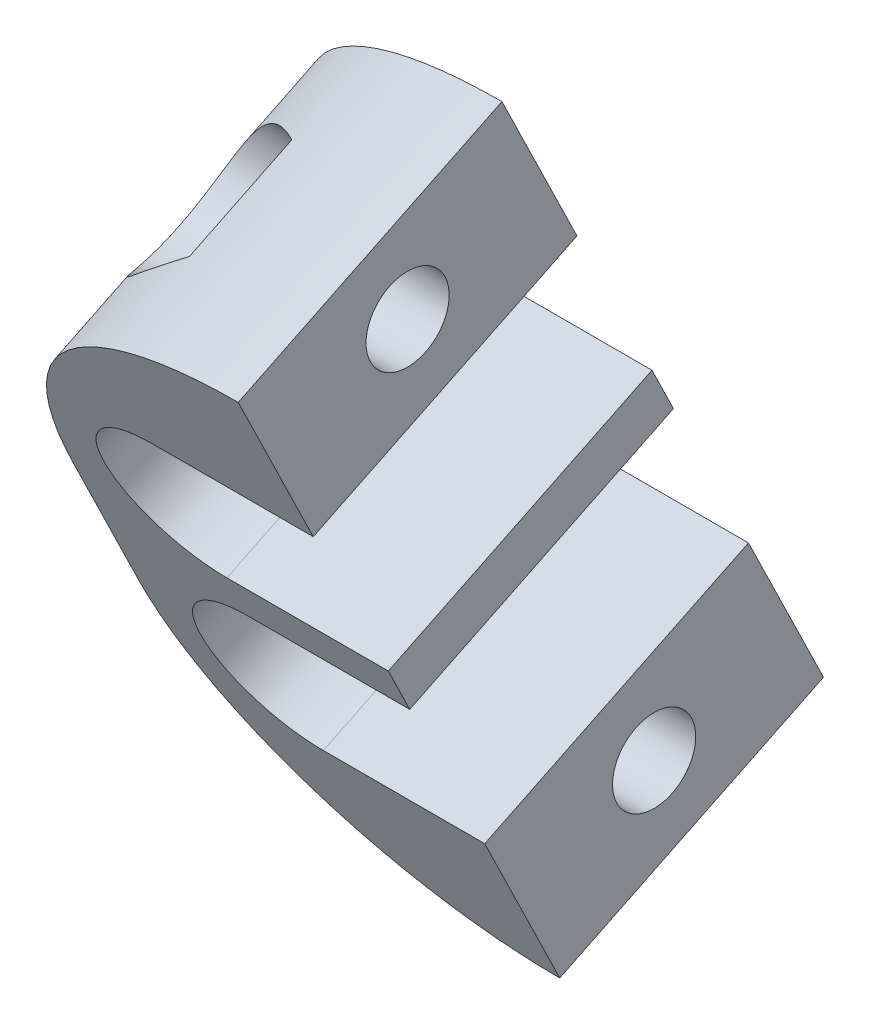
ISO-10303-21;
HEADER;
FILE_DESCRIPTION(('STEP AP214'),'2;1');
FILE_NAME('part.step','',(''),(''),'','','');
FILE_SCHEMA(('AUTOMOTIVE_DESIGN { 1 0 10303 214 1 1 1 1 }'));
ENDSEC;
DATA;
#1=APPLICATION_CONTEXT('core data for automotive mechanical design processes');
#2=APPLICATION_PROTOCOL_DEFINITION('international standard','automotive_design',2000,#1);
#3=PRODUCT_CONTEXT('',#1,'mechanical');
#4=PRODUCT('Part','Part','',(#3));
#5=PRODUCT_RELATED_PRODUCT_CATEGORY('part','',(#4));
#6=PRODUCT_DEFINITION_FORMATION('','',#4);
#7=PRODUCT_DEFINITION_CONTEXT('part definition',#1,'design');
#8=PRODUCT_DEFINITION('design','',#6,#7);
#9=PRODUCT_DEFINITION_SHAPE('','',#8);
#10=(LENGTH_UNIT() NAMED_UNIT(*) SI_UNIT(.MILLI.,.METRE.));
#11=(NAMED_UNIT(*) PLANE_ANGLE_UNIT() SI_UNIT($,.RADIAN.));
#12=(NAMED_UNIT(*) SI_UNIT($,.STERADIAN.) SOLID_ANGLE_UNIT());
#13=UNCERTAINTY_MEASURE_WITH_UNIT(LENGTH_MEASURE(1.E-05),#10,'distance_accuracy_value','');
#14=(GEOMETRIC_REPRESENTATION_CONTEXT(3) GLOBAL_UNCERTAINTY_ASSIGNED_CONTEXT((#13)) GLOBAL_UNIT_ASSIGNED_CONTEXT((#10,
#11,#12)) REPRESENTATION_CONTEXT('',''));
#15=CARTESIAN_POINT('',(0.,0.,0.));
#16=DIRECTION('',(0.,0.,1.));
#17=DIRECTION('',(1.,0.,0.));
#18=AXIS2_PLACEMENT_3D('',#15,#16,#17);
#19=CARTESIAN_POINT('',(-2.46,-10.163821388975,-156.551134403672));
#20=DIRECTION('',(0.,-0.438371146789076,0.898794046299168));
#21=DIRECTION('',(0.,-0.898794046299168,-0.438371146789076));
#22=AXIS2_PLACEMENT_3D('',#19,#20,#21);
#23=PLANE('',#22);
#24=DIRECTION('',(0.,-0.898794046299168,-0.438371146789076));
#25=VECTOR('',#24,1.);
#26=CARTESIAN_POINT('',(9.54,-10.163821388975,-156.551134403672));
#27=LINE('',#26,#25);
#28=CARTESIAN_POINT('',(9.54,4.21688335181169,-149.537196055047));
#29=VERTEX_POINT('',#28);
#30=CARTESIAN_POINT('',(9.54,2.41929525921333,-150.413938348625));
#31=VERTEX_POINT('',#30);
#32=EDGE_CURVE('E143',#29,#31,#27,.T.);
#33=ORIENTED_EDGE('',*,*,#32,.F.);
#34=DIRECTION('',(-1.,0.,0.));
#35=VECTOR('',#34,1.);
#36=CARTESIAN_POINT('',(2.94,4.2168833518117,-149.537196055047));
#37=LINE('',#36,#35);
#38=CARTESIAN_POINT('',(2.94,4.2168833518117,-149.537196055047));
#39=VERTEX_POINT('',#38);
#40=EDGE_CURVE('E178',#29,#39,#37,.T.);
#41=ORIENTED_EDGE('',*,*,#40,.T.);
#42=CARTESIAN_POINT('',(2.94,7.36266251385877,-148.002897041285));
#43=DIRECTION('',(0.,-0.438371146789076,0.898794046299168));
#44=DIRECTION('',(0.,-0.898794046299168,-0.438371146789076));
#45=AXIS2_PLACEMENT_3D('',#42,#43,#44);
#46=CIRCLE('',#45,3.49999999999999);
#47=CARTESIAN_POINT('',(2.94,10.5084416759058,-146.468598027523));
#48=VERTEX_POINT('',#47);
#49=EDGE_CURVE('E180',#39,#48,#46,.F.);
#50=ORIENTED_EDGE('',*,*,#49,.T.);
#51=DIRECTION('',(1.,0.,0.));
#52=VECTOR('',#51,1.);
#53=CARTESIAN_POINT('',(2.94,10.5084416759058,-146.468598027523));
#54=LINE('',#53,#52);
#55=CARTESIAN_POINT('',(9.54,10.5084416759058,-146.468598027523));
#56=VERTEX_POINT('',#55);
#57=EDGE_CURVE('E193',#48,#56,#54,.T.);
#58=ORIENTED_EDGE('',*,*,#57,.T.);
#59=CARTESIAN_POINT('',(9.54,16.8,-143.4));
#60=VERTEX_POINT('',#59);
#61=EDGE_CURVE('E52',#60,#56,#27,.T.);
#62=ORIENTED_EDGE('',*,*,#61,.F.);
#63=CARTESIAN_POINT('',(9.54,6.01447144440999,-148.660453761469));
#64=DIRECTION('',(0.,-0.438371146789076,0.898794046299168));
#65=DIRECTION('',(0.,-0.898794046299168,-0.438371146789076));
#66=AXIS2_PLACEMENT_3D('',#63,#64,#65);
#67=CIRCLE('',#66,12.);
#68=CARTESIAN_POINT('',(-2.46,6.01447144441,-148.660453761469));
#69=VERTEX_POINT('',#68);
#70=EDGE_CURVE('E215',#60,#69,#67,.T.);
#71=ORIENTED_EDGE('',*,*,#70,.T.);
#72=DIRECTION('',(0.,-0.898794046299168,-0.438371146789076));
#73=VECTOR('',#72,1.);
#74=CARTESIAN_POINT('',(-2.46,-10.163821388975,-156.551134403672));
#75=LINE('',#74,#73);
#76=CARTESIAN_POINT('',(-2.46,0.621707166615,-151.290680642203));
#77=VERTEX_POINT('',#76);
#78=EDGE_CURVE('E198',#69,#77,#75,.T.);
#79=ORIENTED_EDGE('',*,*,#78,.T.);
#80=CARTESIAN_POINT('',(9.54,0.621707166615,-151.290680642203));
#81=DIRECTION('',(0.,-0.438371146789076,0.898794046299168));
#82=DIRECTION('',(0.,-0.898794046299168,-0.438371146789076));
#83=AXIS2_PLACEMENT_3D('',#80,#81,#82);
#84=CIRCLE('',#83,12.);
#85=CARTESIAN_POINT('',(9.54,-10.163821388975,-156.551134403672));
#86=VERTEX_POINT('',#85);
#87=EDGE_CURVE('E217',#77,#86,#84,.T.);
#88=ORIENTED_EDGE('',*,*,#87,.T.);
#89=CARTESIAN_POINT('',(9.54,-3.87226306488086,-153.482536376149));
#90=VERTEX_POINT('',#89);
#91=EDGE_CURVE('E283',#90,#86,#27,.T.);
#92=ORIENTED_EDGE('',*,*,#91,.F.);
#93=DIRECTION('',(-1.,0.,0.));
#94=VECTOR('',#93,1.);
#95=CARTESIAN_POINT('',(2.94,-3.87226306488085,-153.482536376149));
#96=LINE('',#95,#94);
#97=CARTESIAN_POINT('',(2.94,-3.87226306488085,-153.482536376149));
#98=VERTEX_POINT('',#97);
#99=EDGE_CURVE('E306',#90,#98,#96,.T.);
#100=ORIENTED_EDGE('',*,*,#99,.T.);
#101=CARTESIAN_POINT('',(2.94,-0.726483902833755,-151.948237362387));
#102=DIRECTION('',(0.,-0.438371146789076,0.898794046299168));
#103=DIRECTION('',(0.,-0.898794046299168,-0.438371146789076));
#104=AXIS2_PLACEMENT_3D('',#101,#102,#103);
#105=CIRCLE('',#104,3.5);
#106=CARTESIAN_POINT('',(2.94,2.41929525921333,-150.413938348625));
#107=VERTEX_POINT('',#106);
#108=EDGE_CURVE('E168',#98,#107,#105,.F.);
#109=ORIENTED_EDGE('',*,*,#108,.T.);
#110=DIRECTION('',(1.,0.,0.));
#111=VECTOR('',#110,1.);
#112=CARTESIAN_POINT('',(2.94,2.41929525921333,-150.413938348625));
#113=LINE('',#112,#111);
#114=EDGE_CURVE('E175',#107,#31,#113,.T.);
#115=ORIENTED_EDGE('',*,*,#114,.T.);
#116=EDGE_LOOP('',(#33,#41,#50,#58,#62,#71,#79,#88,#92,#100,#109,#115));
#117=FACE_BOUND('',#116,.T.);
#118=ADVANCED_FACE('F36',(#117),#23,.T.);
#119=CARTESIAN_POINT('',(-2.46,-4.90336762750616,-167.336662959262));
#120=DIRECTION('',(0.,0.438371146789072,-0.89879404629917));
#121=DIRECTION('',(0.,0.89879404629917,0.438371146789072));
#122=AXIS2_PLACEMENT_3D('',#119,#120,#121);
#123=PLANE('',#122);
#124=DIRECTION('',(0.,0.89879404629917,0.438371146789072));
#125=VECTOR('',#124,1.);
#126=CARTESIAN_POINT('',(9.54,-4.90336762750616,-167.336662959262));
#127=LINE('',#126,#125);
#128=CARTESIAN_POINT('',(9.54,7.67974902068235,-161.199466904216));
#129=VERTEX_POINT('',#128);
#130=CARTESIAN_POINT('',(9.54,9.47733711328061,-160.322724610637));
#131=VERTEX_POINT('',#130);
#132=EDGE_CURVE('E140',#129,#131,#127,.T.);
#133=ORIENTED_EDGE('',*,*,#132,.F.);
#134=DIRECTION('',(1.,0.,0.));
#135=VECTOR('',#134,1.);
#136=CARTESIAN_POINT('',(2.94,7.67974902068235,-161.199466904216));
#137=LINE('',#136,#135);
#138=CARTESIAN_POINT('',(2.94,7.67974902068224,-161.199466904215));
#139=VERTEX_POINT('',#138);
#140=EDGE_CURVE('E155',#139,#129,#137,.T.);
#141=ORIENTED_EDGE('',*,*,#140,.F.);
#142=CARTESIAN_POINT('',(2.94,4.53396985863526,-162.733765917977));
#143=DIRECTION('',(0.,0.438371146789075,-0.898794046299168));
#144=DIRECTION('',(0.,0.898794046299168,0.438371146789075));
#145=AXIS2_PLACEMENT_3D('',#142,#143,#144);
#146=CIRCLE('',#145,3.5);
#147=CARTESIAN_POINT('',(2.94,1.38819069658818,-164.268064931739));
#148=VERTEX_POINT('',#147);
#149=EDGE_CURVE('E165',#148,#139,#146,.T.);
#150=ORIENTED_EDGE('',*,*,#149,.F.);
#151=DIRECTION('',(-1.,0.,0.));
#152=VECTOR('',#151,1.);
#153=CARTESIAN_POINT('',(2.94,1.38819069658818,-164.268064931739));
#154=LINE('',#153,#152);
#155=CARTESIAN_POINT('',(9.54,1.38819069658818,-164.268064931739));
#156=VERTEX_POINT('',#155);
#157=EDGE_CURVE('E164',#156,#148,#154,.T.);
#158=ORIENTED_EDGE('',*,*,#157,.F.);
#159=CARTESIAN_POINT('',(9.54,-4.90336762750616,-167.336662959262));
#160=VERTEX_POINT('',#159);
#161=EDGE_CURVE('E60',#160,#156,#127,.T.);
#162=ORIENTED_EDGE('',*,*,#161,.F.);
#163=CARTESIAN_POINT('',(9.54,5.88216092808388,-162.076209197793));
#164=DIRECTION('',(0.,0.438371146789072,-0.89879404629917));
#165=DIRECTION('',(0.,0.89879404629917,0.438371146789072));
#166=AXIS2_PLACEMENT_3D('',#163,#164,#165);
#167=CIRCLE('',#166,12.);
#168=CARTESIAN_POINT('',(-2.46,5.88216092808388,-162.076209197793));
#169=VERTEX_POINT('',#168);
#170=EDGE_CURVE('E209',#160,#169,#167,.T.);
#171=ORIENTED_EDGE('',*,*,#170,.T.);
#172=DIRECTION('',(0.,0.89879404629917,0.438371146789072));
#173=VECTOR('',#172,1.);
#174=CARTESIAN_POINT('',(-2.46,-4.90336762750616,-167.336662959262));
#175=LINE('',#174,#173);
#176=CARTESIAN_POINT('',(-2.46,11.2749252058789,-159.445982317059));
#177=VERTEX_POINT('',#176);
#178=EDGE_CURVE('E201',#169,#177,#175,.T.);
#179=ORIENTED_EDGE('',*,*,#178,.T.);
#180=CARTESIAN_POINT('',(9.54,11.2749252058789,-159.445982317059));
#181=DIRECTION('',(0.,0.438371146789072,-0.89879404629917));
#182=DIRECTION('',(0.,0.89879404629917,0.438371146789072));
#183=AXIS2_PLACEMENT_3D('',#180,#181,#182);
#184=CIRCLE('',#183,12.);
#185=CARTESIAN_POINT('',(9.54,22.0604537614689,-154.18552855559));
#186=VERTEX_POINT('',#185);
#187=EDGE_CURVE('E206',#177,#186,#184,.T.);
#188=ORIENTED_EDGE('',*,*,#187,.T.);
#189=CARTESIAN_POINT('',(9.54,15.7688954373749,-157.254126583114));
#190=VERTEX_POINT('',#189);
#191=EDGE_CURVE('E158',#190,#186,#127,.T.);
#192=ORIENTED_EDGE('',*,*,#191,.F.);
#193=DIRECTION('',(1.,0.,0.));
#194=VECTOR('',#193,1.);
#195=CARTESIAN_POINT('',(2.94,15.7688954373749,-157.254126583114));
#196=LINE('',#195,#194);
#197=CARTESIAN_POINT('',(2.94,15.7688954373748,-157.254126583114));
#198=VERTEX_POINT('',#197);
#199=EDGE_CURVE('E185',#198,#190,#196,.T.);
#200=ORIENTED_EDGE('',*,*,#199,.F.);
#201=CARTESIAN_POINT('',(2.94,12.6231162753278,-158.788425596876));
#202=DIRECTION('',(0.,0.438371146789075,-0.898794046299168));
#203=DIRECTION('',(0.,0.898794046299168,0.438371146789075));
#204=AXIS2_PLACEMENT_3D('',#201,#202,#203);
#205=CIRCLE('',#204,3.49999999999999);
#206=CARTESIAN_POINT('',(2.94,9.47733711328072,-160.322724610637));
#207=VERTEX_POINT('',#206);
#208=EDGE_CURVE('E183',#207,#198,#205,.T.);
#209=ORIENTED_EDGE('',*,*,#208,.F.);
#210=DIRECTION('',(-1.,0.,0.));
#211=VECTOR('',#210,1.);
#212=CARTESIAN_POINT('',(2.94,9.47733711328072,-160.322724610637));
#213=LINE('',#212,#211);
#214=EDGE_CURVE('E157',#131,#207,#213,.T.);
#215=ORIENTED_EDGE('',*,*,#214,.F.);
#216=EDGE_LOOP('',(#133,#141,#150,#158,#162,#171,#179,#188,#192,#200,#209,#215));
#217=FACE_BOUND('',#216,.T.);
#218=ADVANCED_FACE('F153',(#217),#123,.T.);
#219=CARTESIAN_POINT('',(-2.46,0.,0.));
#220=DIRECTION('',(-1.,0.,0.));
#221=DIRECTION('',(0.,0.,1.));
#222=AXIS2_PLACEMENT_3D('',#219,#220,#221);
#223=PLANE('',#222);
#224=ORIENTED_EDGE('',*,*,#178,.F.);
#225=DIRECTION('',(0.,0.438371146789071,-0.89879404629917));
#226=VECTOR('',#225,1.);
#227=CARTESIAN_POINT('',(-2.46,-59.1071074742507,-28.8284625310564));
#228=LINE('',#227,#226);
#229=EDGE_CURVE('E213',#169,#77,#228,.F.);
#230=ORIENTED_EDGE('',*,*,#229,.T.);
#231=ORIENTED_EDGE('',*,*,#78,.F.);
#232=DIRECTION('',(0.,-0.438371146789072,0.89879404629917));
#233=VECTOR('',#232,1.);
#234=CARTESIAN_POINT('',(-2.46,-53.7143431964559,-26.1982356503221));
#235=LINE('',#234,#233);
#236=EDGE_CURVE('E211',#69,#177,#235,.F.);
#237=ORIENTED_EDGE('',*,*,#236,.T.);
#238=EDGE_LOOP('',(#224,#230,#231,#237));
#239=FACE_BOUND('',#238,.T.);
#240=ADVANCED_FACE('F271',(#239),#223,.T.);
#241=CARTESIAN_POINT('',(9.54,0.621707166615027,-151.290680642203));
#242=DIRECTION('',(0.,0.438371146789071,-0.89879404629917));
#243=DIRECTION('',(0.,0.89879404629917,0.438371146789071));
#244=AXIS2_PLACEMENT_3D('',#241,#242,#243);
#245=CYLINDRICAL_SURFACE('',#244,12.);
#246=DIRECTION('',(0.,0.438371146789071,-0.89879404629917));
#247=VECTOR('',#246,1.);
#248=CARTESIAN_POINT('',(3.54,-8.71883455576843,-155.846367235069));
#249=LINE('',#248,#247);
#250=CARTESIAN_POINT('',(3.54,-5.06811746003792,-163.331446520964));
#251=VERTEX_POINT('',#250);
#252=CARTESIAN_POINT('',(3.54,-7.10909789003004,-159.146816504763));
#253=VERTEX_POINT('',#252);
#254=EDGE_CURVE('E229',#251,#253,#249,.F.);
#255=ORIENTED_EDGE('',*,*,#254,.F.);
#256=CARTESIAN_POINT('',(3.54,-7.10909789003004,-159.146816504763));
#257=CARTESIAN_POINT('',(3.45147543524019,-7.08136956730593,-159.087078964285));
#258=CARTESIAN_POINT('',(3.36305237885451,-7.05163710845399,-159.028141145551));
#259=CARTESIAN_POINT('',(3.1865453442599,-6.98809152686562,-158.911948456941));
#260=CARTESIAN_POINT('',(3.09846142526258,-6.95427772216764,-158.854693870315));
#261=CARTESIAN_POINT('',(2.8344814400549,-6.84642220255065,-158.685298310777));
#262=CARTESIAN_POINT('',(2.65934826105411,-6.76611887891145,-158.575856878171));
#263=CARTESIAN_POINT('',(2.31035653871057,-6.58708627532792,-158.364448900393));
#264=CARTESIAN_POINT('',(2.13654325075512,-6.48813360105681,-158.26259640375));
#265=CARTESIAN_POINT('',(1.79423378762633,-6.27184593354249,-158.070517290732));
#266=CARTESIAN_POINT('',(1.62573048139374,-6.15453697681156,-157.980274532535));
#267=CARTESIAN_POINT('',(1.36519059055849,-5.95433604702257,-157.849580300513));
#268=CARTESIAN_POINT('',(1.27079472283647,-5.87771450525889,-157.804148409326));
#269=CARTESIAN_POINT('',(1.08477355198881,-5.71808260887051,-157.719141055814));
#270=CARTESIAN_POINT('',(0.993148241317257,-5.63507227164859,-157.679565577538));
#271=CARTESIAN_POINT('',(0.813516632259689,-5.46308359366087,-157.607375901792));
#272=CARTESIAN_POINT('',(0.725497486058442,-5.37413008119485,-157.574734865379));
#273=CARTESIAN_POINT('',(0.553274313188446,-5.19024414732348,-157.517301423513));
#274=CARTESIAN_POINT('',(0.469069516265187,-5.09531294236718,-157.492507427351));
#275=CARTESIAN_POINT('',(0.25406989272694,-4.83909500089433,-157.439327108459));
#276=CARTESIAN_POINT('',(0.126789117355995,-4.67318741486222,-157.418259163841));
#277=CARTESIAN_POINT('',(-0.113345531197287,-4.3300393929126,-157.405258384683));
#278=CARTESIAN_POINT('',(-0.226208208315304,-4.15280597290097,-157.41330768177));
#279=CARTESIAN_POINT('',(-0.417310254326616,-3.82283600540803,-157.459386358957));
#280=CARTESIAN_POINT('',(-0.498187291657957,-3.67091387874153,-157.492220037515));
#281=CARTESIAN_POINT('',(-0.646392830574479,-3.36816955825545,-157.583774298782));
#282=CARTESIAN_POINT('',(-0.713725974734677,-3.2173470046677,-157.642485988929));
#283=CARTESIAN_POINT('',(-0.834009151847841,-2.92187556414726,-157.786968191867));
#284=CARTESIAN_POINT('',(-0.886882035328497,-2.7772631341072,-157.872878763668));
#285=CARTESIAN_POINT('',(-0.977057867617987,-2.50151118537336,-158.070667227685));
#286=CARTESIAN_POINT('',(-1.01436592115021,-2.37036726013182,-158.182536587559));
#287=CARTESIAN_POINT('',(-1.07029910886554,-2.13937485646163,-158.417365883961));
#288=CARTESIAN_POINT('',(-1.09037869013531,-2.03772815158504,-158.538216761926));
#289=CARTESIAN_POINT('',(-1.11756860186276,-1.85419748800361,-158.795380046718));
#290=CARTESIAN_POINT('',(-1.12468334074725,-1.77230681988716,-158.931687181211));
#291=CARTESIAN_POINT('',(-1.12592255648849,-1.63446371036688,-159.208819309818));
#292=CARTESIAN_POINT('',(-1.12064727195262,-1.5774650696278,-159.349123220534));
#293=CARTESIAN_POINT('',(-1.09834132808781,-1.48541016984897,-159.635839178955));
#294=CARTESIAN_POINT('',(-1.08131211655516,-1.45035120939123,-159.782250472293));
#295=CARTESIAN_POINT('',(-1.03559146135752,-1.40266174204805,-160.076428561781));
#296=CARTESIAN_POINT('',(-1.00693331169883,-1.38996775323001,-160.224190320726));
#297=CARTESIAN_POINT('',(-0.93809276176259,-1.38616679106525,-160.51725317741));
#298=CARTESIAN_POINT('',(-0.89790965046466,-1.39506114984163,-160.662554122746));
#299=CARTESIAN_POINT('',(-0.804743639199565,-1.43349367418349,-160.951826799783));
#300=CARTESIAN_POINT('',(-0.751362439658757,-1.46374253789995,-161.09557455467));
#301=CARTESIAN_POINT('',(-0.633257924949577,-1.54299445594052,-161.372826257571));
#302=CARTESIAN_POINT('',(-0.568531738761267,-1.59200226122299,-161.506327600249));
#303=CARTESIAN_POINT('',(-0.422602862593802,-1.71052366629602,-161.771584876892));
#304=CARTESIAN_POINT('',(-0.340458590075532,-1.78144583958995,-161.902187818243));
#305=CARTESIAN_POINT('',(-0.165283010033199,-1.93747931426271,-162.146520632702));
#306=CARTESIAN_POINT('',(-0.0722456534202559,-2.02259851070043,-162.260241050446));
#307=CARTESIAN_POINT('',(0.0958568026249091,-2.17786175199873,-162.44087651463));
#308=CARTESIAN_POINT('',(0.168714349250912,-2.24557756020053,-162.51200808647));
#309=CARTESIAN_POINT('',(0.318724578644622,-2.38505164574232,-162.645274083225));
#310=CARTESIAN_POINT('',(0.395878736098246,-2.45681131111998,-162.707405392385));
#311=CARTESIAN_POINT('',(0.554028629878301,-2.60331777744013,-162.822955993005));
#312=CARTESIAN_POINT('',(0.635029899576246,-2.67806885508754,-162.876362213137));
#313=CARTESIAN_POINT('',(0.800291284692504,-2.82951932052686,-162.974725248043));
#314=CARTESIAN_POINT('',(0.88455229366772,-2.90621924052772,-163.019679725959));
#315=CARTESIAN_POINT('',(1.08840828137032,-3.09010300412865,-163.117089369142));
#316=CARTESIAN_POINT('',(1.20927516097705,-3.19780716967797,-163.165914784434));
#317=CARTESIAN_POINT('',(1.45533969394698,-3.41376372948256,-163.249430119203));
#318=CARTESIAN_POINT('',(1.58053919942882,-3.52201634087959,-163.284113910349));
#319=CARTESIAN_POINT('',(1.8345914280993,-3.73803110278273,-163.340514560872));
#320=CARTESIAN_POINT('',(1.96345008615974,-3.84579208361746,-163.362208926262));
#321=CARTESIAN_POINT('',(2.22381504521336,-4.05972885656027,-163.393564254384));
#322=CARTESIAN_POINT('',(2.35532068805234,-4.16590503155868,-163.403228171746));
#323=CARTESIAN_POINT('',(2.6612310591872,-4.40850422446352,-163.41268405806));
#324=CARTESIAN_POINT('',(2.8363723215665,-4.54416983586684,-163.408518197103));
#325=CARTESIAN_POINT('',(3.10003212922197,-4.74378348515854,-163.389148998803));
#326=CARTESIAN_POINT('',(3.18779420204598,-4.80946971873425,-163.380554127101));
#327=CARTESIAN_POINT('',(3.36366989981615,-4.93967562356453,-163.359140899455));
#328=CARTESIAN_POINT('',(3.45178352789693,-5.00419528438897,-163.346322505768));
#329=CARTESIAN_POINT('',(3.54,-5.06811746003792,-163.331446520964));
#330=B_SPLINE_CURVE_WITH_KNOTS('',3,(#256,#257,#258,#259,#260,#261,#262,#263,#264,#265,#266,
#267,#268,#269,#270,#271,#272,#273,#274,#275,#276,#277,#278,#279,#280,#281,#282,#283,#284,#285,
#286,#287,#288,#289,#290,#291,#292,#293,#294,#295,#296,#297,#298,#299,#300,#301,#302,#303,#304,
#305,#306,#307,#308,#309,#310,#311,#312,#313,#314,#315,#316,#317,#318,#319,#320,#321,#322,#323,
#324,#325,#326,#327,#328,#329),.UNSPECIFIED.,.F.,.F.,(4,2,2,2,2,2,2,2,2,2,2,2,2,2,2,2,2,2,2,2,2,
2,2,2,2,2,2,2,2,2,2,2,2,2,2,2,4),(0.,0.330962839356586,0.661981056818781,1.32584733610063,
1.99823945579138,2.6696863594047,3.05878802271052,3.4478886261591,3.83545466049662,
4.22294207918313,4.85088292271839,5.47843848329819,6.00187361027973,6.52512900728366,
7.05112394471791,7.57694623822004,8.05207395795104,8.5270400901488,8.97947411142595,
9.43185241384153,9.88294458015236,10.3340645821079,10.8009526157164,11.2679589734225,
11.7754200780996,12.2831643319763,12.6495522292363,13.016066662883,13.3831252455848,
13.7502851690986,14.2568085649275,14.7635512320279,15.2711689140671,15.7786619026542,
16.442479149004,16.7722823483982,17.1020884950532),.UNSPECIFIED.);
#331=EDGE_CURVE('E222',#253,#251,#330,.T.);
#332=ORIENTED_EDGE('',*,*,#331,.F.);
#333=EDGE_LOOP('',(#255,#332));
#334=FACE_BOUND('',#333,.T.);
#335=ORIENTED_EDGE('',*,*,#87,.F.);
#336=ORIENTED_EDGE('',*,*,#229,.F.);
#337=ORIENTED_EDGE('',*,*,#170,.F.);
#338=DIRECTION('',(0.,0.438371146789071,-0.89879404629917));
#339=VECTOR('',#338,1.);
#340=CARTESIAN_POINT('',(9.54,-10.163821388975,-156.551134403672));
#341=LINE('',#340,#339);
#342=EDGE_CURVE('E204',#86,#160,#341,.T.);
#343=ORIENTED_EDGE('',*,*,#342,.F.);
#344=EDGE_LOOP('',(#335,#336,#337,#343));
#345=FACE_BOUND('',#344,.T.);
#346=ADVANCED_FACE('F230',(#334,#345),#245,.T.);
#347=CARTESIAN_POINT('',(9.54,6.01447144440997,-148.660453761469));
#348=DIRECTION('',(0.,-0.438371146789072,0.89879404629917));
#349=DIRECTION('',(0.,-0.89879404629917,-0.438371146789072));
#350=AXIS2_PLACEMENT_3D('',#347,#348,#349);
#351=CYLINDRICAL_SURFACE('',#350,12.);
#352=DIRECTION('',(0.,-0.438371146789072,0.89879404629917));
#353=VECTOR('',#352,1.);
#354=CARTESIAN_POINT('',(3.54,15.3550131667934,-144.104767168603));
#355=LINE('',#354,#353);
#356=CARTESIAN_POINT('',(3.54,16.9647498325319,-147.405216438298));
#357=VERTEX_POINT('',#356);
#358=CARTESIAN_POINT('',(3.54,19.005730262524,-151.589846454499));
#359=VERTEX_POINT('',#358);
#360=EDGE_CURVE('E11',#357,#359,#355,.F.);
#361=ORIENTED_EDGE('',*,*,#360,.F.);
#362=CARTESIAN_POINT('',(3.54,19.005730262524,-151.589846454499));
#363=CARTESIAN_POINT('',(3.4514754352402,18.9780019397999,-151.649583994977));
#364=CARTESIAN_POINT('',(3.36305237885452,18.948269480948,-151.708521813712));
#365=CARTESIAN_POINT('',(3.18654534425992,18.8847238993596,-151.824714502321));
#366=CARTESIAN_POINT('',(3.09846142526261,18.8509100946616,-151.881969088948));
#367=CARTESIAN_POINT('',(2.83448144005493,18.7430545750446,-152.051364648486));
#368=CARTESIAN_POINT('',(2.65934826105414,18.6627512514054,-152.160806081091));
#369=CARTESIAN_POINT('',(2.3103565387106,18.4837186478219,-152.372214058869));
#370=CARTESIAN_POINT('',(2.13654325075515,18.3847659735508,-152.474066555512));
#371=CARTESIAN_POINT('',(1.79423378762638,18.1684783060365,-152.666145668531));
#372=CARTESIAN_POINT('',(1.6257304813938,18.0511693493056,-152.756388426728));
#373=CARTESIAN_POINT('',(1.36519059055856,17.8509684195166,-152.887082658749));
#374=CARTESIAN_POINT('',(1.27079472283653,17.7743468777529,-152.932514549936));
#375=CARTESIAN_POINT('',(1.08477355198887,17.6147149813645,-153.017521903448));
#376=CARTESIAN_POINT('',(0.993148241317308,17.5317046441426,-153.057097381724));
#377=CARTESIAN_POINT('',(0.813516632259733,17.3597159661549,-153.12928705747));
#378=CARTESIAN_POINT('',(0.725497486058485,17.2707624536889,-153.161928093884));
#379=CARTESIAN_POINT('',(0.553274313188486,17.0868765198175,-153.21936153575));
#380=CARTESIAN_POINT('',(0.469069516265224,16.9919453148612,-153.244155531912));
#381=CARTESIAN_POINT('',(0.254069892726974,16.7357273733884,-153.297335850803));
#382=CARTESIAN_POINT('',(0.126789117356027,16.5698197873562,-153.318403795421));
#383=CARTESIAN_POINT('',(-0.113345531197262,16.2266717654066,-153.331404574579));
#384=CARTESIAN_POINT('',(-0.226208208315282,16.049438345395,-153.323355277492));
#385=CARTESIAN_POINT('',(-0.417310254326596,15.7194683779021,-153.277276600305));
#386=CARTESIAN_POINT('',(-0.498187291657938,15.5675462512355,-153.244442921747));
#387=CARTESIAN_POINT('',(-0.64639283057446,15.2648019307495,-153.15288866048));
#388=CARTESIAN_POINT('',(-0.713725974734658,15.1139793771617,-153.094176970333));
#389=CARTESIAN_POINT('',(-0.834009151847826,14.8185079366413,-152.949694767396));
#390=CARTESIAN_POINT('',(-0.886882035328485,14.6738955066012,-152.863784195594));
#391=CARTESIAN_POINT('',(-0.977057867617979,14.3981435578674,-152.665995731577));
#392=CARTESIAN_POINT('',(-1.0143659211502,14.2669996326258,-152.554126371703));
#393=CARTESIAN_POINT('',(-1.07029910886553,14.0360072289556,-152.319297075301));
#394=CARTESIAN_POINT('',(-1.0903786901353,13.934360524079,-152.198446197336));
#395=CARTESIAN_POINT('',(-1.11756860186275,13.7508298604976,-151.941282912544));
#396=CARTESIAN_POINT('',(-1.12468334074724,13.6689391923812,-151.804975778051));
#397=CARTESIAN_POINT('',(-1.12592255648849,13.5310960828609,-151.527843649445));
#398=CARTESIAN_POINT('',(-1.12064727195262,13.4740974421218,-151.387539738729));
#399=CARTESIAN_POINT('',(-1.09834132808781,13.382042542343,-151.100823780308));
#400=CARTESIAN_POINT('',(-1.08131211655516,13.3469835818852,-150.95441248697));
#401=CARTESIAN_POINT('',(-1.03559146135752,13.299294114542,-150.660234397482));
#402=CARTESIAN_POINT('',(-1.00693331169884,13.286600125724,-150.512472638537));
#403=CARTESIAN_POINT('',(-0.938092761762597,13.2827991635592,-150.219409781852));
#404=CARTESIAN_POINT('',(-0.897909650464661,13.2916935223356,-150.074108836517));
#405=CARTESIAN_POINT('',(-0.804743639199562,13.3301260466775,-149.78483615948));
#406=CARTESIAN_POINT('',(-0.751362439658759,13.3603749103939,-149.641088404593));
#407=CARTESIAN_POINT('',(-0.633257924949583,13.4396268284345,-149.363836701692));
#408=CARTESIAN_POINT('',(-0.568531738761273,13.488634633717,-149.230335359013));
#409=CARTESIAN_POINT('',(-0.422602862593813,13.60715603879,-148.96507808237));
#410=CARTESIAN_POINT('',(-0.340458590075549,13.6780782120839,-148.83447514102));
#411=CARTESIAN_POINT('',(-0.165283010033213,13.8341116867567,-148.590142326561));
#412=CARTESIAN_POINT('',(-0.0722456534202608,13.9192308831944,-148.476421908816));
#413=CARTESIAN_POINT('',(0.0958568026249059,14.0744941244927,-148.295786444632));
#414=CARTESIAN_POINT('',(0.168714349250906,14.1422099326945,-148.224654872792));
#415=CARTESIAN_POINT('',(0.318724578644613,14.2816840182363,-148.091388876037));
#416=CARTESIAN_POINT('',(0.395878736098235,14.3534436836139,-148.029257566878));
#417=CARTESIAN_POINT('',(0.554028629878295,14.4999501499341,-147.913706966258));
#418=CARTESIAN_POINT('',(0.635029899576246,14.5747012275815,-147.860300746126));
#419=CARTESIAN_POINT('',(0.800291284692516,14.7261516930208,-147.76193771122));
#420=CARTESIAN_POINT('',(0.884552293667739,14.8028516130217,-147.716983233303));
#421=CARTESIAN_POINT('',(1.08840828137035,14.9867353766227,-147.619573590121));
#422=CARTESIAN_POINT('',(1.20927516097708,15.094439542172,-147.570748174828));
#423=CARTESIAN_POINT('',(1.45533969394701,15.3103961019766,-147.48723284006));
#424=CARTESIAN_POINT('',(1.58053919942885,15.4186487133736,-147.452549048914));
#425=CARTESIAN_POINT('',(1.83459142809933,15.6346634752767,-147.39614839839));
#426=CARTESIAN_POINT('',(1.96345008615977,15.7424244561115,-147.374454033));
#427=CARTESIAN_POINT('',(2.22381504521339,15.9563612290543,-147.343098704878));
#428=CARTESIAN_POINT('',(2.35532068805237,16.0625374040527,-147.333434787517));
#429=CARTESIAN_POINT('',(2.66123105918722,16.3051365969575,-147.323978901203));
#430=CARTESIAN_POINT('',(2.83637232156652,16.4408022083608,-147.328144762159));
#431=CARTESIAN_POINT('',(3.10003212922198,16.6404158576525,-147.34751396046));
#432=CARTESIAN_POINT('',(3.18779420204598,16.7061020912282,-147.356108832162));
#433=CARTESIAN_POINT('',(3.36366989981615,16.8363079960585,-147.377522059808));
#434=CARTESIAN_POINT('',(3.45178352789693,16.9008276568829,-147.390340453494));
#435=CARTESIAN_POINT('',(3.54,16.9647498325319,-147.405216438298));
#436=B_SPLINE_CURVE_WITH_KNOTS('',3,(#362,#363,#364,#365,#366,#367,#368,#369,#370,#371,#372,
#373,#374,#375,#376,#377,#378,#379,#380,#381,#382,#383,#384,#385,#386,#387,#388,#389,#390,#391,
#392,#393,#394,#395,#396,#397,#398,#399,#400,#401,#402,#403,#404,#405,#406,#407,#408,#409,#410,
#411,#412,#413,#414,#415,#416,#417,#418,#419,#420,#421,#422,#423,#424,#425,#426,#427,#428,#429,
#430,#431,#432,#433,#434,#435),.UNSPECIFIED.,.F.,.F.,(4,2,2,2,2,2,2,2,2,2,2,2,2,2,2,2,2,2,2,2,2,
2,2,2,2,2,2,2,2,2,2,2,2,2,2,2,4),(0.,0.330962839356586,0.661981056818769,1.3258473361006,
1.99823945579133,2.66968635940463,3.05878802271044,3.44788862615904,3.83545466049656,
4.22294207918309,4.85088292271835,5.47843848329816,6.0018736102797,6.52512900728364,
7.05112394471788,7.57694623822004,8.05207395795101,8.52704009014872,8.97947411142587,
9.43185241384148,9.88294458015231,10.334064582108,10.8009526157164,11.2679589734224,
11.7754200780995,12.2831643319763,12.6495522292363,13.016066662883,13.3831252455849,
13.7502851690986,14.2568085649275,14.7635512320279,15.2711689140671,15.7786619026542,
16.442479149004,16.7722823483982,17.1020884950532),.UNSPECIFIED.);
#437=EDGE_CURVE('E45',#359,#357,#436,.T.);
#438=ORIENTED_EDGE('',*,*,#437,.F.);
#439=EDGE_LOOP('',(#361,#438));
#440=FACE_BOUND('',#439,.T.);
#441=ORIENTED_EDGE('',*,*,#187,.F.);
#442=ORIENTED_EDGE('',*,*,#236,.F.);
#443=ORIENTED_EDGE('',*,*,#70,.F.);
#444=DIRECTION('',(0.,-0.438371146789072,0.89879404629917));
#445=VECTOR('',#444,1.);
#446=CARTESIAN_POINT('',(9.54,16.8,-143.4));
#447=LINE('',#446,#445);
#448=EDGE_CURVE('E220',#186,#60,#447,.T.);
#449=ORIENTED_EDGE('',*,*,#448,.F.);
#450=EDGE_LOOP('',(#441,#442,#443,#449));
#451=FACE_BOUND('',#450,.T.);
#452=ADVANCED_FACE('F38',(#440,#451),#351,.T.);
#453=CARTESIAN_POINT('',(2.94,-65.0763175242255,0.519022010886017));
#454=DIRECTION('',(0.,0.438371146789075,-0.898794046299168));
#455=DIRECTION('',(0.,0.898794046299168,0.438371146789075));
#456=AXIS2_PLACEMENT_3D('',#453,#454,#455);
#457=CYLINDRICAL_SURFACE('',#456,3.49999999999999);
#458=DIRECTION('',(0.,0.438371146789075,-0.898794046299168));
#459=VECTOR('',#458,1.);
#460=CARTESIAN_POINT('',(2.94,-68.2220966862726,-1.01527700287573));
#461=LINE('',#460,#459);
#462=EDGE_CURVE('E190',#39,#207,#461,.T.);
#463=ORIENTED_EDGE('',*,*,#462,.T.);
#464=ORIENTED_EDGE('',*,*,#208,.T.);
#465=DIRECTION('',(0.,0.438371146789075,-0.898794046299168));
#466=VECTOR('',#465,1.);
#467=CARTESIAN_POINT('',(2.94,-61.9305383621784,2.05332102464779));
#468=LINE('',#467,#466);
#469=EDGE_CURVE('E189',#48,#198,#468,.T.);
#470=ORIENTED_EDGE('',*,*,#469,.F.);
#471=ORIENTED_EDGE('',*,*,#49,.F.);
#472=EDGE_LOOP('',(#463,#464,#470,#471));
#473=FACE_BOUND('',#472,.T.);
#474=ADVANCED_FACE('F263',(#473),#457,.F.);
#475=CARTESIAN_POINT('',(2.94,-68.2220966862726,-1.01527700287573));
#476=DIRECTION('',(0.,-0.898794046299168,-0.438371146789075));
#477=DIRECTION('',(0.,0.438371146789075,-0.898794046299168));
#478=AXIS2_PLACEMENT_3D('',#475,#476,#477);
#479=PLANE('',#478);
#480=ORIENTED_EDGE('',*,*,#40,.F.);
#481=DIRECTION('',(0.,-0.438371146789075,0.898794046299168));
#482=VECTOR('',#481,1.);
#483=CARTESIAN_POINT('',(9.54,-55.5119312890544,-27.0749779439006));
#484=LINE('',#483,#482);
#485=EDGE_CURVE('E286',#131,#29,#484,.T.);
#486=ORIENTED_EDGE('',*,*,#485,.F.);
#487=ORIENTED_EDGE('',*,*,#214,.T.);
#488=ORIENTED_EDGE('',*,*,#462,.F.);
#489=EDGE_LOOP('',(#480,#486,#487,#488));
#490=FACE_BOUND('',#489,.T.);
#491=ADVANCED_FACE('F260',(#490),#479,.F.);
#492=CARTESIAN_POINT('',(2.94,-61.9305383621784,2.05332102464779));
#493=DIRECTION('',(0.,0.898794046299168,0.438371146789075));
#494=DIRECTION('',(0.,-0.438371146789075,0.898794046299168));
#495=AXIS2_PLACEMENT_3D('',#492,#493,#494);
#496=PLANE('',#495);
#497=ORIENTED_EDGE('',*,*,#199,.T.);
#498=DIRECTION('',(0.,0.438371146789075,-0.898794046299168));
#499=VECTOR('',#498,1.);
#500=CARTESIAN_POINT('',(9.54,-49.2203729649603,-24.006379916377));
#501=LINE('',#500,#499);
#502=EDGE_CURVE('E290',#56,#190,#501,.T.);
#503=ORIENTED_EDGE('',*,*,#502,.F.);
#504=ORIENTED_EDGE('',*,*,#57,.F.);
#505=ORIENTED_EDGE('',*,*,#469,.T.);
#506=EDGE_LOOP('',(#497,#503,#504,#505));
#507=FACE_BOUND('',#506,.T.);
#508=ADVANCED_FACE('F258',(#507),#496,.F.);
#509=CARTESIAN_POINT('',(2.94,-73.165463940918,-3.42631831021565));
#510=DIRECTION('',(0.,0.438371146789075,-0.898794046299168));
#511=DIRECTION('',(0.,0.898794046299168,0.438371146789075));
#512=AXIS2_PLACEMENT_3D('',#509,#510,#511);
#513=CYLINDRICAL_SURFACE('',#512,3.5);
#514=DIRECTION('',(0.,0.438371146789075,-0.898794046299168));
#515=VECTOR('',#514,1.);
#516=CARTESIAN_POINT('',(2.94,-76.3112431029652,-4.96061732397742));
#517=LINE('',#516,#515);
#518=EDGE_CURVE('E172',#98,#148,#517,.T.);
#519=ORIENTED_EDGE('',*,*,#518,.T.);
#520=ORIENTED_EDGE('',*,*,#149,.T.);
#521=DIRECTION('',(0.,0.438371146789075,-0.898794046299168));
#522=VECTOR('',#521,1.);
#523=CARTESIAN_POINT('',(2.94,-70.019684778871,-1.89201929645391));
#524=LINE('',#523,#522);
#525=EDGE_CURVE('E163',#107,#139,#524,.T.);
#526=ORIENTED_EDGE('',*,*,#525,.F.);
#527=ORIENTED_EDGE('',*,*,#108,.F.);
#528=EDGE_LOOP('',(#519,#520,#526,#527));
#529=FACE_BOUND('',#528,.T.);
#530=ADVANCED_FACE('F252',(#529),#513,.F.);
#531=CARTESIAN_POINT('',(2.94,-76.3112431029652,-4.96061732397742));
#532=DIRECTION('',(0.,-0.898794046299168,-0.438371146789075));
#533=DIRECTION('',(0.,0.438371146789075,-0.898794046299168));
#534=AXIS2_PLACEMENT_3D('',#531,#532,#533);
#535=PLANE('',#534);
#536=ORIENTED_EDGE('',*,*,#99,.F.);
#537=DIRECTION('',(0.,-0.438371146789075,0.898794046299168));
#538=VECTOR('',#537,1.);
#539=CARTESIAN_POINT('',(9.54,-63.601077705747,-31.0203182650022));
#540=LINE('',#539,#538);
#541=EDGE_CURVE('E147',#156,#90,#540,.T.);
#542=ORIENTED_EDGE('',*,*,#541,.F.);
#543=ORIENTED_EDGE('',*,*,#157,.T.);
#544=ORIENTED_EDGE('',*,*,#518,.F.);
#545=EDGE_LOOP('',(#536,#542,#543,#544));
#546=FACE_BOUND('',#545,.T.);
#547=ADVANCED_FACE('F249',(#546),#535,.F.);
#548=CARTESIAN_POINT('',(2.94,-70.019684778871,-1.89201929645391));
#549=DIRECTION('',(0.,0.898794046299168,0.438371146789075));
#550=DIRECTION('',(0.,-0.438371146789075,0.898794046299168));
#551=AXIS2_PLACEMENT_3D('',#548,#549,#550);
#552=PLANE('',#551);
#553=ORIENTED_EDGE('',*,*,#140,.T.);
#554=DIRECTION('',(0.,0.438371146789075,-0.898794046299168));
#555=VECTOR('',#554,1.);
#556=CARTESIAN_POINT('',(9.54,-57.3095193816528,-27.9517202374787));
#557=LINE('',#556,#555);
#558=EDGE_CURVE('E137',#31,#129,#557,.T.);
#559=ORIENTED_EDGE('',*,*,#558,.F.);
#560=ORIENTED_EDGE('',*,*,#114,.F.);
#561=ORIENTED_EDGE('',*,*,#525,.T.);
#562=EDGE_LOOP('',(#553,#559,#560,#561));
#563=FACE_BOUND('',#562,.T.);
#564=ADVANCED_FACE('F161',(#563),#552,.F.);
#565=CARTESIAN_POINT('',(-2.46,-4.38781534619346,-160.409599667706));
#566=DIRECTION('',(-1.,0.,0.));
#567=DIRECTION('',(0.,0.,1.));
#568=AXIS2_PLACEMENT_3D('',#565,#566,#567);
#569=CYLINDRICAL_SURFACE('',#568,1.69999999999999);
#570=CARTESIAN_POINT('',(9.54,-4.38781534619346,-160.409599667706));
#571=DIRECTION('',(-1.,0.,0.));
#572=DIRECTION('',(0.,0.,1.));
#573=AXIS2_PLACEMENT_3D('',#570,#571,#572);
#574=CIRCLE('',#573,1.69999999999999);
#575=CARTESIAN_POINT('',(9.54,-4.38781534619346,-158.709599667706));
#576=VERTEX_POINT('',#575);
#577=EDGE_CURVE('E148',#576,#576,#574,.T.);
#578=ORIENTED_EDGE('',*,*,#577,.F.);
#579=EDGE_LOOP('',(#578));
#580=FACE_BOUND('',#579,.T.);
#581=CARTESIAN_POINT('',(3.54,-4.38781534619346,-160.409599667706));
#582=DIRECTION('',(-1.,0.,0.));
#583=DIRECTION('',(0.,0.,1.));
#584=AXIS2_PLACEMENT_3D('',#581,#582,#583);
#585=CIRCLE('',#584,1.7);
#586=CARTESIAN_POINT('',(3.54,-4.38781534619346,-158.709599667706));
#587=VERTEX_POINT('',#586);
#588=EDGE_CURVE('E309',#587,#587,#585,.T.);
#589=ORIENTED_EDGE('',*,*,#588,.T.);
#590=EDGE_LOOP('',(#589));
#591=FACE_BOUND('',#590,.T.);
#592=ADVANCED_FACE('F244',(#580,#591),#569,.F.);
#593=CARTESIAN_POINT('',(3.54,-2.68781534619346,-160.409599667706));
#594=DIRECTION('',(1.,0.,0.));
#595=DIRECTION('',(0.,0.,-1.));
#596=AXIS2_PLACEMENT_3D('',#593,#594,#595);
#597=PLANE('',#596);
#598=ORIENTED_EDGE('',*,*,#254,.T.);
#599=CARTESIAN_POINT('',(3.54,-4.38781534619346,-160.409599667706));
#600=DIRECTION('',(-1.,0.,0.));
#601=DIRECTION('',(0.,0.,1.));
#602=AXIS2_PLACEMENT_3D('',#599,#600,#601);
#603=CIRCLE('',#602,3.);
#604=EDGE_CURVE('E312',#253,#251,#603,.T.);
#605=ORIENTED_EDGE('',*,*,#604,.T.);
#606=EDGE_LOOP('',(#598,#605));
#607=FACE_BOUND('',#606,.T.);
#608=ORIENTED_EDGE('',*,*,#588,.F.);
#609=EDGE_LOOP('',(#608));
#610=FACE_BOUND('',#609,.T.);
#611=ADVANCED_FACE('F239',(#607,#610),#597,.F.);
#612=CARTESIAN_POINT('',(-2.46,-4.38781534619346,-160.409599667706));
#613=DIRECTION('',(-1.,0.,0.));
#614=DIRECTION('',(0.,0.,1.));
#615=AXIS2_PLACEMENT_3D('',#612,#613,#614);
#616=CYLINDRICAL_SURFACE('',#615,3.);
#617=ORIENTED_EDGE('',*,*,#331,.T.);
#618=ORIENTED_EDGE('',*,*,#604,.F.);
#619=EDGE_LOOP('',(#617,#618));
#620=FACE_BOUND('',#619,.T.);
#621=ADVANCED_FACE('F233',(#620),#616,.F.);
#622=CARTESIAN_POINT('',(-2.46,16.2844477186874,-150.327063291557));
#623=DIRECTION('',(-1.,0.,0.));
#624=DIRECTION('',(0.,0.,1.));
#625=AXIS2_PLACEMENT_3D('',#622,#623,#624);
#626=CYLINDRICAL_SURFACE('',#625,1.69999999999999);
#627=CARTESIAN_POINT('',(9.54,16.2844477186874,-150.327063291557));
#628=DIRECTION('',(-1.,0.,0.));
#629=DIRECTION('',(0.,0.,1.));
#630=AXIS2_PLACEMENT_3D('',#627,#628,#629);
#631=CIRCLE('',#630,1.69999999999999);
#632=CARTESIAN_POINT('',(9.54,16.2844477186874,-148.627063291557));
#633=VERTEX_POINT('',#632);
#634=EDGE_CURVE('E328',#633,#633,#631,.T.);
#635=ORIENTED_EDGE('',*,*,#634,.F.);
#636=EDGE_LOOP('',(#635));
#637=FACE_BOUND('',#636,.T.);
#638=CARTESIAN_POINT('',(3.54,16.2844477186874,-150.327063291557));
#639=DIRECTION('',(-1.,0.,0.));
#640=DIRECTION('',(0.,0.,1.));
#641=AXIS2_PLACEMENT_3D('',#638,#639,#640);
#642=CIRCLE('',#641,1.7);
#643=CARTESIAN_POINT('',(3.54,16.2844477186874,-148.627063291557));
#644=VERTEX_POINT('',#643);
#645=EDGE_CURVE('E317',#644,#644,#642,.T.);
#646=ORIENTED_EDGE('',*,*,#645,.T.);
#647=EDGE_LOOP('',(#646));
#648=FACE_BOUND('',#647,.T.);
#649=ADVANCED_FACE('F238',(#637,#648),#626,.F.);
#650=CARTESIAN_POINT('',(3.54,17.9844477186874,-150.327063291557));
#651=DIRECTION('',(1.,0.,0.));
#652=DIRECTION('',(0.,0.,-1.));
#653=AXIS2_PLACEMENT_3D('',#650,#651,#652);
#654=PLANE('',#653);
#655=ORIENTED_EDGE('',*,*,#360,.T.);
#656=CARTESIAN_POINT('',(3.54,16.2844477186874,-150.327063291557));
#657=DIRECTION('',(-1.,0.,0.));
#658=DIRECTION('',(0.,0.,1.));
#659=AXIS2_PLACEMENT_3D('',#656,#657,#658);
#660=CIRCLE('',#659,3.);
#661=EDGE_CURVE('E320',#359,#357,#660,.T.);
#662=ORIENTED_EDGE('',*,*,#661,.T.);
#663=EDGE_LOOP('',(#655,#662));
#664=FACE_BOUND('',#663,.T.);
#665=ORIENTED_EDGE('',*,*,#645,.F.);
#666=EDGE_LOOP('',(#665));
#667=FACE_BOUND('',#666,.T.);
#668=ADVANCED_FACE('F341',(#664,#667),#654,.F.);
#669=CARTESIAN_POINT('',(-2.46,16.2844477186874,-150.327063291557));
#670=DIRECTION('',(-1.,0.,0.));
#671=DIRECTION('',(0.,0.,1.));
#672=AXIS2_PLACEMENT_3D('',#669,#670,#671);
#673=CYLINDRICAL_SURFACE('',#672,3.);
#674=ORIENTED_EDGE('',*,*,#437,.T.);
#675=ORIENTED_EDGE('',*,*,#661,.F.);
#676=EDGE_LOOP('',(#674,#675));
#677=FACE_BOUND('',#676,.T.);
#678=ADVANCED_FACE('F333',(#677),#673,.F.);
#679=CARTESIAN_POINT('',(9.54,0.,0.));
#680=DIRECTION('',(-1.,0.,0.));
#681=DIRECTION('',(0.,0.,1.));
#682=AXIS2_PLACEMENT_3D('',#679,#680,#681);
#683=PLANE('',#682);
#684=ORIENTED_EDGE('',*,*,#634,.T.);
#685=EDGE_LOOP('',(#684));
#686=FACE_BOUND('',#685,.T.);
#687=ORIENTED_EDGE('',*,*,#502,.T.);
#688=ORIENTED_EDGE('',*,*,#191,.T.);
#689=ORIENTED_EDGE('',*,*,#448,.T.);
#690=ORIENTED_EDGE('',*,*,#61,.T.);
#691=EDGE_LOOP('',(#687,#688,#689,#690));
#692=FACE_BOUND('',#691,.T.);
#693=ADVANCED_FACE('F330',(#686,#692),#683,.F.);
#694=ORIENTED_EDGE('',*,*,#577,.T.);
#695=EDGE_LOOP('',(#694));
#696=FACE_BOUND('',#695,.T.);
#697=ORIENTED_EDGE('',*,*,#541,.T.);
#698=ORIENTED_EDGE('',*,*,#91,.T.);
#699=ORIENTED_EDGE('',*,*,#342,.T.);
#700=ORIENTED_EDGE('',*,*,#161,.T.);
#701=EDGE_LOOP('',(#697,#698,#699,#700));
#702=FACE_BOUND('',#701,.T.);
#703=ADVANCED_FACE('F332',(#696,#702),#683,.F.);
#704=ORIENTED_EDGE('',*,*,#485,.T.);
#705=ORIENTED_EDGE('',*,*,#32,.T.);
#706=ORIENTED_EDGE('',*,*,#558,.T.);
#707=ORIENTED_EDGE('',*,*,#132,.T.);
#708=EDGE_LOOP('',(#704,#705,#706,#707));
#709=FACE_BOUND('',#708,.T.);
#710=ADVANCED_FACE('F139',(#709),#683,.F.);
#711=CLOSED_SHELL('',(#118,#218,#240,#346,#452,#474,#491,#508,#530,#547,#564,#592,#611,#621,
#649,#668,#678,#693,#703,#710));
#712=MANIFOLD_SOLID_BREP('B2',#711);
#713=ADVANCED_BREP_SHAPE_REPRESENTATION('',(#18,#712),#14);
#714=SHAPE_DEFINITION_REPRESENTATION(#9,#713);
ENDSEC;
END-ISO-10303-21;
